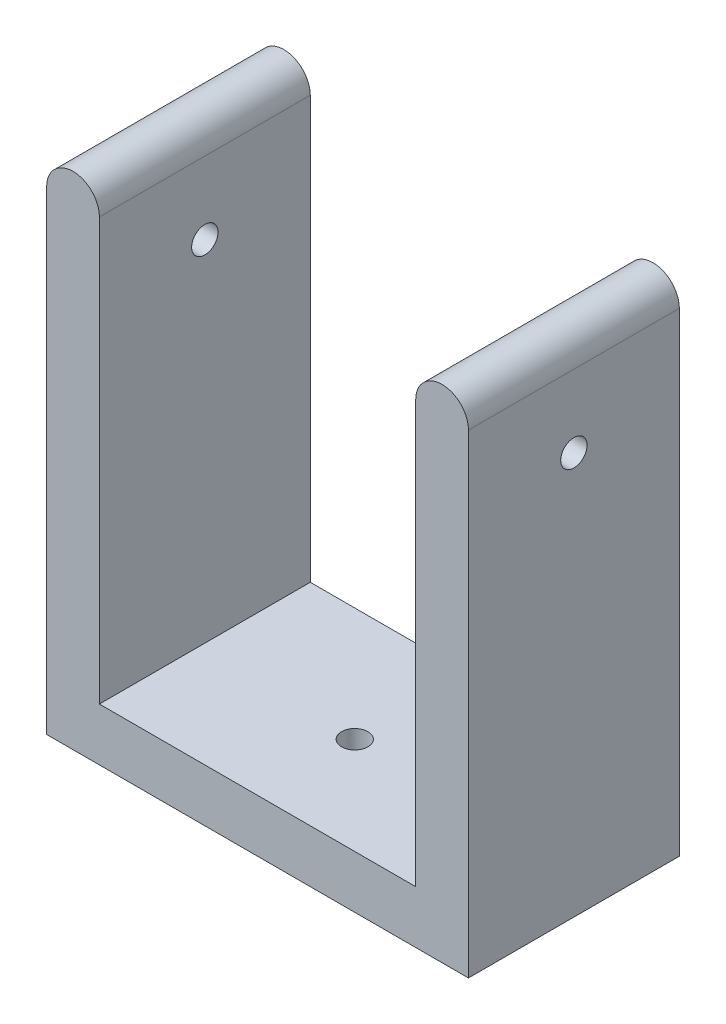
ISO-10303-21;
HEADER;
FILE_DESCRIPTION(('STEP AP214'),'2;1');
FILE_NAME('part.step','',(''),(''),'','','');
FILE_SCHEMA(('AUTOMOTIVE_DESIGN { 1 0 10303 214 1 1 1 1 }'));
ENDSEC;
DATA;
#1=APPLICATION_CONTEXT('core data for automotive mechanical design processes');
#2=APPLICATION_PROTOCOL_DEFINITION('international standard','automotive_design',2000,#1);
#3=PRODUCT_CONTEXT('',#1,'mechanical');
#4=PRODUCT('Part','Part','',(#3));
#5=PRODUCT_RELATED_PRODUCT_CATEGORY('part','',(#4));
#6=PRODUCT_DEFINITION_FORMATION('','',#4);
#7=PRODUCT_DEFINITION_CONTEXT('part definition',#1,'design');
#8=PRODUCT_DEFINITION('design','',#6,#7);
#9=PRODUCT_DEFINITION_SHAPE('','',#8);
#10=(LENGTH_UNIT() NAMED_UNIT(*) SI_UNIT(.MILLI.,.METRE.));
#11=(NAMED_UNIT(*) PLANE_ANGLE_UNIT() SI_UNIT($,.RADIAN.));
#12=(NAMED_UNIT(*) SI_UNIT($,.STERADIAN.) SOLID_ANGLE_UNIT());
#13=UNCERTAINTY_MEASURE_WITH_UNIT(LENGTH_MEASURE(1.E-05),#10,'distance_accuracy_value','');
#14=(GEOMETRIC_REPRESENTATION_CONTEXT(3) GLOBAL_UNCERTAINTY_ASSIGNED_CONTEXT((#13)) GLOBAL_UNIT_ASSIGNED_CONTEXT((#10,
#11,#12)) REPRESENTATION_CONTEXT('',''));
#15=CARTESIAN_POINT('',(0.,0.,0.));
#16=DIRECTION('',(0.,0.,1.));
#17=DIRECTION('',(1.,0.,0.));
#18=AXIS2_PLACEMENT_3D('',#15,#16,#17);
#19=CARTESIAN_POINT('',(-15.,4.99999999999999,20.));
#20=DIRECTION('',(-1.,0.,0.));
#21=DIRECTION('',(0.,0.,1.));
#22=AXIS2_PLACEMENT_3D('',#19,#20,#21);
#23=PLANE('',#22);
#24=CARTESIAN_POINT('',(-15.,38.1376510848989,10.));
#25=DIRECTION('',(-1.,0.,0.));
#26=DIRECTION('',(0.,0.,1.));
#27=AXIS2_PLACEMENT_3D('',#24,#25,#26);
#28=CIRCLE('',#27,1.25);
#29=CARTESIAN_POINT('',(-15.,38.1376510848989,11.25));
#30=VERTEX_POINT('',#29);
#31=EDGE_CURVE('E143',#30,#30,#28,.T.);
#32=ORIENTED_EDGE('',*,*,#31,.T.);
#33=EDGE_LOOP('',(#32));
#34=FACE_BOUND('',#33,.T.);
#35=DIRECTION('',(0.,1.,0.));
#36=VECTOR('',#35,1.);
#37=CARTESIAN_POINT('',(-15.,4.99999999999999,0.));
#38=LINE('',#37,#36);
#39=CARTESIAN_POINT('',(-15.,4.99999999999999,0.));
#40=VERTEX_POINT('',#39);
#41=CARTESIAN_POINT('',(-15.,45.,0.));
#42=VERTEX_POINT('',#41);
#43=EDGE_CURVE('E137',#40,#42,#38,.T.);
#44=ORIENTED_EDGE('',*,*,#43,.T.);
#45=DIRECTION('',(0.,0.,-1.));
#46=VECTOR('',#45,1.);
#47=CARTESIAN_POINT('',(-15.,45.,20.));
#48=LINE('',#47,#46);
#49=CARTESIAN_POINT('',(-15.,45.,20.));
#50=VERTEX_POINT('',#49);
#51=EDGE_CURVE('E11',#50,#42,#48,.T.);
#52=ORIENTED_EDGE('',*,*,#51,.F.);
#53=DIRECTION('',(0.,1.,0.));
#54=VECTOR('',#53,1.);
#55=CARTESIAN_POINT('',(-15.,4.99999999999999,20.));
#56=LINE('',#55,#54);
#57=CARTESIAN_POINT('',(-15.,4.99999999999999,20.));
#58=VERTEX_POINT('',#57);
#59=EDGE_CURVE('E155',#58,#50,#56,.T.);
#60=ORIENTED_EDGE('',*,*,#59,.F.);
#61=DIRECTION('',(0.,0.,-1.));
#62=VECTOR('',#61,1.);
#63=CARTESIAN_POINT('',(-15.,4.99999999999999,20.));
#64=LINE('',#63,#62);
#65=EDGE_CURVE('E134',#58,#40,#64,.T.);
#66=ORIENTED_EDGE('',*,*,#65,.T.);
#67=EDGE_LOOP('',(#44,#52,#60,#66));
#68=FACE_BOUND('',#67,.T.);
#69=ADVANCED_FACE('F39',(#34,#68),#23,.F.);
#70=CARTESIAN_POINT('',(-17.5,45.,20.));
#71=DIRECTION('',(0.,0.,-1.));
#72=DIRECTION('',(-1.,0.,0.));
#73=AXIS2_PLACEMENT_3D('',#70,#71,#72);
#74=CYLINDRICAL_SURFACE('',#73,2.5);
#75=CARTESIAN_POINT('',(-17.5,45.,0.));
#76=DIRECTION('',(0.,0.,1.));
#77=DIRECTION('',(-1.,0.,0.));
#78=AXIS2_PLACEMENT_3D('',#75,#76,#77);
#79=CIRCLE('',#78,2.5);
#80=CARTESIAN_POINT('',(-20.,45.,0.));
#81=VERTEX_POINT('',#80);
#82=EDGE_CURVE('E140',#42,#81,#79,.T.);
#83=ORIENTED_EDGE('',*,*,#82,.T.);
#84=DIRECTION('',(0.,0.,-1.));
#85=VECTOR('',#84,1.);
#86=CARTESIAN_POINT('',(-20.,45.,20.));
#87=LINE('',#86,#85);
#88=CARTESIAN_POINT('',(-20.,45.,20.));
#89=VERTEX_POINT('',#88);
#90=EDGE_CURVE('E48',#89,#81,#87,.T.);
#91=ORIENTED_EDGE('',*,*,#90,.F.);
#92=CARTESIAN_POINT('',(-17.5,45.,20.));
#93=DIRECTION('',(0.,0.,1.));
#94=DIRECTION('',(-1.,0.,0.));
#95=AXIS2_PLACEMENT_3D('',#92,#93,#94);
#96=CIRCLE('',#95,2.5);
#97=EDGE_CURVE('E99',#50,#89,#96,.T.);
#98=ORIENTED_EDGE('',*,*,#97,.F.);
#99=ORIENTED_EDGE('',*,*,#51,.T.);
#100=EDGE_LOOP('',(#83,#91,#98,#99));
#101=FACE_BOUND('',#100,.T.);
#102=ADVANCED_FACE('F220',(#101),#74,.T.);
#103=CARTESIAN_POINT('',(-20.,45.,20.));
#104=DIRECTION('',(1.,0.,0.));
#105=DIRECTION('',(0.,1.,0.));
#106=AXIS2_PLACEMENT_3D('',#103,#104,#105);
#107=PLANE('',#106);
#108=CARTESIAN_POINT('',(-20.,38.1376510848989,10.));
#109=DIRECTION('',(-1.,0.,0.));
#110=DIRECTION('',(0.,-1.,0.));
#111=AXIS2_PLACEMENT_3D('',#108,#109,#110);
#112=CIRCLE('',#111,1.25);
#113=CARTESIAN_POINT('',(-20.,36.8876510848989,10.));
#114=VERTEX_POINT('',#113);
#115=EDGE_CURVE('E172',#114,#114,#112,.T.);
#116=ORIENTED_EDGE('',*,*,#115,.F.);
#117=EDGE_LOOP('',(#116));
#118=FACE_BOUND('',#117,.T.);
#119=DIRECTION('',(0.,-1.,0.));
#120=VECTOR('',#119,1.);
#121=CARTESIAN_POINT('',(-20.,45.,0.));
#122=LINE('',#121,#120);
#123=CARTESIAN_POINT('',(-20.,0.,0.));
#124=VERTEX_POINT('',#123);
#125=EDGE_CURVE('E141',#81,#124,#122,.T.);
#126=ORIENTED_EDGE('',*,*,#125,.T.);
#127=DIRECTION('',(0.,0.,-1.));
#128=VECTOR('',#127,1.);
#129=CARTESIAN_POINT('',(-20.,0.,20.));
#130=LINE('',#129,#128);
#131=CARTESIAN_POINT('',(-20.,0.,20.));
#132=VERTEX_POINT('',#131);
#133=EDGE_CURVE('E157',#132,#124,#130,.T.);
#134=ORIENTED_EDGE('',*,*,#133,.F.);
#135=DIRECTION('',(0.,-1.,0.));
#136=VECTOR('',#135,1.);
#137=CARTESIAN_POINT('',(-20.,45.,20.));
#138=LINE('',#137,#136);
#139=EDGE_CURVE('E185',#89,#132,#138,.T.);
#140=ORIENTED_EDGE('',*,*,#139,.F.);
#141=ORIENTED_EDGE('',*,*,#90,.T.);
#142=EDGE_LOOP('',(#126,#134,#140,#141));
#143=FACE_BOUND('',#142,.T.);
#144=ADVANCED_FACE('F221',(#118,#143),#107,.F.);
#145=CARTESIAN_POINT('',(-20.,0.,20.));
#146=DIRECTION('',(0.,1.,0.));
#147=DIRECTION('',(-1.,0.,0.));
#148=AXIS2_PLACEMENT_3D('',#145,#146,#147);
#149=PLANE('',#148);
#150=CARTESIAN_POINT('',(0.,0.,10.7831152364034));
#151=DIRECTION('',(0.,-1.,0.));
#152=DIRECTION('',(1.,0.,0.));
#153=AXIS2_PLACEMENT_3D('',#150,#151,#152);
#154=CIRCLE('',#153,1.25);
#155=CARTESIAN_POINT('',(1.25,0.,10.7831152364034));
#156=VERTEX_POINT('',#155);
#157=EDGE_CURVE('E179',#156,#156,#154,.T.);
#158=ORIENTED_EDGE('',*,*,#157,.F.);
#159=EDGE_LOOP('',(#158));
#160=FACE_BOUND('',#159,.T.);
#161=DIRECTION('',(1.,0.,0.));
#162=VECTOR('',#161,1.);
#163=CARTESIAN_POINT('',(-20.,0.,0.));
#164=LINE('',#163,#162);
#165=CARTESIAN_POINT('',(20.,0.,0.));
#166=VERTEX_POINT('',#165);
#167=EDGE_CURVE('E144',#124,#166,#164,.T.);
#168=ORIENTED_EDGE('',*,*,#167,.T.);
#169=DIRECTION('',(0.,0.,-1.));
#170=VECTOR('',#169,1.);
#171=CARTESIAN_POINT('',(20.,0.,20.));
#172=LINE('',#171,#170);
#173=CARTESIAN_POINT('',(20.,0.,20.));
#174=VERTEX_POINT('',#173);
#175=EDGE_CURVE('E156',#174,#166,#172,.T.);
#176=ORIENTED_EDGE('',*,*,#175,.F.);
#177=DIRECTION('',(1.,0.,0.));
#178=VECTOR('',#177,1.);
#179=CARTESIAN_POINT('',(-20.,0.,20.));
#180=LINE('',#179,#178);
#181=EDGE_CURVE('E184',#132,#174,#180,.T.);
#182=ORIENTED_EDGE('',*,*,#181,.F.);
#183=ORIENTED_EDGE('',*,*,#133,.T.);
#184=EDGE_LOOP('',(#168,#176,#182,#183));
#185=FACE_BOUND('',#184,.T.);
#186=ADVANCED_FACE('F188',(#160,#185),#149,.F.);
#187=CARTESIAN_POINT('',(20.,0.,20.));
#188=DIRECTION('',(-1.,0.,0.));
#189=DIRECTION('',(0.,-1.,0.));
#190=AXIS2_PLACEMENT_3D('',#187,#188,#189);
#191=PLANE('',#190);
#192=CARTESIAN_POINT('',(20.,38.1376510848989,10.));
#193=DIRECTION('',(-1.,0.,0.));
#194=DIRECTION('',(0.,-1.,0.));
#195=AXIS2_PLACEMENT_3D('',#192,#193,#194);
#196=CIRCLE('',#195,1.25);
#197=CARTESIAN_POINT('',(20.,36.8876510848989,10.));
#198=VERTEX_POINT('',#197);
#199=EDGE_CURVE('E164',#198,#198,#196,.T.);
#200=ORIENTED_EDGE('',*,*,#199,.T.);
#201=EDGE_LOOP('',(#200));
#202=FACE_BOUND('',#201,.T.);
#203=DIRECTION('',(0.,1.,0.));
#204=VECTOR('',#203,1.);
#205=CARTESIAN_POINT('',(20.,0.,0.));
#206=LINE('',#205,#204);
#207=CARTESIAN_POINT('',(20.,45.,0.));
#208=VERTEX_POINT('',#207);
#209=EDGE_CURVE('E150',#166,#208,#206,.T.);
#210=ORIENTED_EDGE('',*,*,#209,.T.);
#211=DIRECTION('',(0.,0.,-1.));
#212=VECTOR('',#211,1.);
#213=CARTESIAN_POINT('',(20.,45.,20.));
#214=LINE('',#213,#212);
#215=CARTESIAN_POINT('',(20.,45.,20.));
#216=VERTEX_POINT('',#215);
#217=EDGE_CURVE('E126',#216,#208,#214,.T.);
#218=ORIENTED_EDGE('',*,*,#217,.F.);
#219=DIRECTION('',(0.,1.,0.));
#220=VECTOR('',#219,1.);
#221=CARTESIAN_POINT('',(20.,0.,20.));
#222=LINE('',#221,#220);
#223=EDGE_CURVE('E116',#174,#216,#222,.T.);
#224=ORIENTED_EDGE('',*,*,#223,.F.);
#225=ORIENTED_EDGE('',*,*,#175,.T.);
#226=EDGE_LOOP('',(#210,#218,#224,#225));
#227=FACE_BOUND('',#226,.T.);
#228=ADVANCED_FACE('F193',(#202,#227),#191,.F.);
#229=CARTESIAN_POINT('',(17.5,45.,20.));
#230=DIRECTION('',(0.,0.,-1.));
#231=DIRECTION('',(-1.,0.,0.));
#232=AXIS2_PLACEMENT_3D('',#229,#230,#231);
#233=CYLINDRICAL_SURFACE('',#232,2.5);
#234=CARTESIAN_POINT('',(17.5,45.,0.));
#235=DIRECTION('',(0.,0.,1.));
#236=DIRECTION('',(-1.,0.,0.));
#237=AXIS2_PLACEMENT_3D('',#234,#235,#236);
#238=CIRCLE('',#237,2.5);
#239=CARTESIAN_POINT('',(15.,45.,0.));
#240=VERTEX_POINT('',#239);
#241=EDGE_CURVE('E130',#208,#240,#238,.T.);
#242=ORIENTED_EDGE('',*,*,#241,.T.);
#243=DIRECTION('',(0.,0.,-1.));
#244=VECTOR('',#243,1.);
#245=CARTESIAN_POINT('',(15.,45.,20.));
#246=LINE('',#245,#244);
#247=CARTESIAN_POINT('',(15.,45.,20.));
#248=VERTEX_POINT('',#247);
#249=EDGE_CURVE('E123',#248,#240,#246,.T.);
#250=ORIENTED_EDGE('',*,*,#249,.F.);
#251=CARTESIAN_POINT('',(17.5,45.,20.));
#252=DIRECTION('',(0.,0.,1.));
#253=DIRECTION('',(-1.,0.,0.));
#254=AXIS2_PLACEMENT_3D('',#251,#252,#253);
#255=CIRCLE('',#254,2.5);
#256=EDGE_CURVE('E114',#216,#248,#255,.T.);
#257=ORIENTED_EDGE('',*,*,#256,.F.);
#258=ORIENTED_EDGE('',*,*,#217,.T.);
#259=EDGE_LOOP('',(#242,#250,#257,#258));
#260=FACE_BOUND('',#259,.T.);
#261=ADVANCED_FACE('F125',(#260),#233,.T.);
#262=CARTESIAN_POINT('',(15.,45.,20.));
#263=DIRECTION('',(1.,0.,0.));
#264=DIRECTION('',(0.,1.,0.));
#265=AXIS2_PLACEMENT_3D('',#262,#263,#264);
#266=PLANE('',#265);
#267=CARTESIAN_POINT('',(15.,38.1376510848989,10.));
#268=DIRECTION('',(1.,0.,0.));
#269=DIRECTION('',(0.,1.,0.));
#270=AXIS2_PLACEMENT_3D('',#267,#268,#269);
#271=CIRCLE('',#270,1.25);
#272=CARTESIAN_POINT('',(15.,39.3876510848989,10.));
#273=VERTEX_POINT('',#272);
#274=EDGE_CURVE('E162',#273,#273,#271,.T.);
#275=ORIENTED_EDGE('',*,*,#274,.T.);
#276=EDGE_LOOP('',(#275));
#277=FACE_BOUND('',#276,.T.);
#278=DIRECTION('',(0.,-1.,0.));
#279=VECTOR('',#278,1.);
#280=CARTESIAN_POINT('',(15.,45.,0.));
#281=LINE('',#280,#279);
#282=CARTESIAN_POINT('',(15.,5.,0.));
#283=VERTEX_POINT('',#282);
#284=EDGE_CURVE('E88',#240,#283,#281,.T.);
#285=ORIENTED_EDGE('',*,*,#284,.T.);
#286=DIRECTION('',(0.,0.,-1.));
#287=VECTOR('',#286,1.);
#288=CARTESIAN_POINT('',(15.,5.,20.));
#289=LINE('',#288,#287);
#290=CARTESIAN_POINT('',(15.,5.,20.));
#291=VERTEX_POINT('',#290);
#292=EDGE_CURVE('E129',#291,#283,#289,.T.);
#293=ORIENTED_EDGE('',*,*,#292,.F.);
#294=DIRECTION('',(0.,-1.,0.));
#295=VECTOR('',#294,1.);
#296=CARTESIAN_POINT('',(15.,45.,20.));
#297=LINE('',#296,#295);
#298=EDGE_CURVE('E120',#248,#291,#297,.T.);
#299=ORIENTED_EDGE('',*,*,#298,.F.);
#300=ORIENTED_EDGE('',*,*,#249,.T.);
#301=EDGE_LOOP('',(#285,#293,#299,#300));
#302=FACE_BOUND('',#301,.T.);
#303=ADVANCED_FACE('F132',(#277,#302),#266,.F.);
#304=CARTESIAN_POINT('',(15.,5.,20.));
#305=DIRECTION('',(0.,-1.,0.));
#306=DIRECTION('',(1.,0.,0.));
#307=AXIS2_PLACEMENT_3D('',#304,#305,#306);
#308=PLANE('',#307);
#309=CARTESIAN_POINT('',(0.,5.,10.7831152364034));
#310=DIRECTION('',(0.,-1.,0.));
#311=DIRECTION('',(1.,0.,0.));
#312=AXIS2_PLACEMENT_3D('',#309,#310,#311);
#313=CIRCLE('',#312,1.25);
#314=CARTESIAN_POINT('',(1.25,5.,10.7831152364034));
#315=VERTEX_POINT('',#314);
#316=EDGE_CURVE('E45',#315,#315,#313,.T.);
#317=ORIENTED_EDGE('',*,*,#316,.T.);
#318=EDGE_LOOP('',(#317));
#319=FACE_BOUND('',#318,.T.);
#320=DIRECTION('',(-1.,0.,0.));
#321=VECTOR('',#320,1.);
#322=CARTESIAN_POINT('',(15.,5.,0.));
#323=LINE('',#322,#321);
#324=EDGE_CURVE('E95',#283,#40,#323,.T.);
#325=ORIENTED_EDGE('',*,*,#324,.T.);
#326=ORIENTED_EDGE('',*,*,#65,.F.);
#327=DIRECTION('',(-1.,0.,0.));
#328=VECTOR('',#327,1.);
#329=CARTESIAN_POINT('',(15.,5.,20.));
#330=LINE('',#329,#328);
#331=EDGE_CURVE('E60',#291,#58,#330,.T.);
#332=ORIENTED_EDGE('',*,*,#331,.F.);
#333=ORIENTED_EDGE('',*,*,#292,.T.);
#334=EDGE_LOOP('',(#325,#326,#332,#333));
#335=FACE_BOUND('',#334,.T.);
#336=ADVANCED_FACE('F205',(#319,#335),#308,.F.);
#337=CARTESIAN_POINT('',(-17.5,45.,20.));
#338=DIRECTION('',(0.,0.,-1.));
#339=DIRECTION('',(-1.,0.,0.));
#340=AXIS2_PLACEMENT_3D('',#337,#338,#339);
#341=PLANE('',#340);
#342=ORIENTED_EDGE('',*,*,#59,.T.);
#343=ORIENTED_EDGE('',*,*,#97,.T.);
#344=ORIENTED_EDGE('',*,*,#139,.T.);
#345=ORIENTED_EDGE('',*,*,#181,.T.);
#346=ORIENTED_EDGE('',*,*,#223,.T.);
#347=ORIENTED_EDGE('',*,*,#256,.T.);
#348=ORIENTED_EDGE('',*,*,#298,.T.);
#349=ORIENTED_EDGE('',*,*,#331,.T.);
#350=EDGE_LOOP('',(#342,#343,#344,#345,#346,#347,#348,#349));
#351=FACE_BOUND('',#350,.T.);
#352=ADVANCED_FACE('F113',(#351),#341,.F.);
#353=CARTESIAN_POINT('',(-17.5,45.,0.));
#354=DIRECTION('',(0.,0.,-1.));
#355=DIRECTION('',(-1.,0.,0.));
#356=AXIS2_PLACEMENT_3D('',#353,#354,#355);
#357=PLANE('',#356);
#358=ORIENTED_EDGE('',*,*,#43,.F.);
#359=ORIENTED_EDGE('',*,*,#324,.F.);
#360=ORIENTED_EDGE('',*,*,#284,.F.);
#361=ORIENTED_EDGE('',*,*,#241,.F.);
#362=ORIENTED_EDGE('',*,*,#209,.F.);
#363=ORIENTED_EDGE('',*,*,#167,.F.);
#364=ORIENTED_EDGE('',*,*,#125,.F.);
#365=ORIENTED_EDGE('',*,*,#82,.F.);
#366=EDGE_LOOP('',(#358,#359,#360,#361,#362,#363,#364,#365));
#367=FACE_BOUND('',#366,.T.);
#368=ADVANCED_FACE('F197',(#367),#357,.T.);
#369=CARTESIAN_POINT('',(20.,38.1376510848989,10.));
#370=DIRECTION('',(-1.,0.,0.));
#371=DIRECTION('',(0.,-1.,0.));
#372=AXIS2_PLACEMENT_3D('',#369,#370,#371);
#373=CYLINDRICAL_SURFACE('',#372,1.25);
#374=ORIENTED_EDGE('',*,*,#199,.F.);
#375=EDGE_LOOP('',(#374));
#376=FACE_BOUND('',#375,.T.);
#377=ORIENTED_EDGE('',*,*,#274,.F.);
#378=EDGE_LOOP('',(#377));
#379=FACE_BOUND('',#378,.T.);
#380=ADVANCED_FACE('F228',(#376,#379),#373,.F.);
#381=ORIENTED_EDGE('',*,*,#115,.T.);
#382=EDGE_LOOP('',(#381));
#383=FACE_BOUND('',#382,.T.);
#384=ORIENTED_EDGE('',*,*,#31,.F.);
#385=EDGE_LOOP('',(#384));
#386=FACE_BOUND('',#385,.T.);
#387=ADVANCED_FACE('F230',(#383,#386),#373,.F.);
#388=CARTESIAN_POINT('',(0.,47.5,10.7831152364034));
#389=DIRECTION('',(0.,-1.,0.));
#390=DIRECTION('',(1.,0.,0.));
#391=AXIS2_PLACEMENT_3D('',#388,#389,#390);
#392=CYLINDRICAL_SURFACE('',#391,1.25);
#393=ORIENTED_EDGE('',*,*,#157,.T.);
#394=EDGE_LOOP('',(#393));
#395=FACE_BOUND('',#394,.T.);
#396=ORIENTED_EDGE('',*,*,#316,.F.);
#397=EDGE_LOOP('',(#396));
#398=FACE_BOUND('',#397,.T.);
#399=ADVANCED_FACE('F226',(#395,#398),#392,.F.);
#400=CLOSED_SHELL('',(#69,#102,#144,#186,#228,#261,#303,#336,#352,#368,#380,#387,#399));
#401=MANIFOLD_SOLID_BREP('B2',#400);
#402=ADVANCED_BREP_SHAPE_REPRESENTATION('',(#18,#401),#14);
#403=SHAPE_DEFINITION_REPRESENTATION(#9,#402);
ENDSEC;
END-ISO-10303-21;
